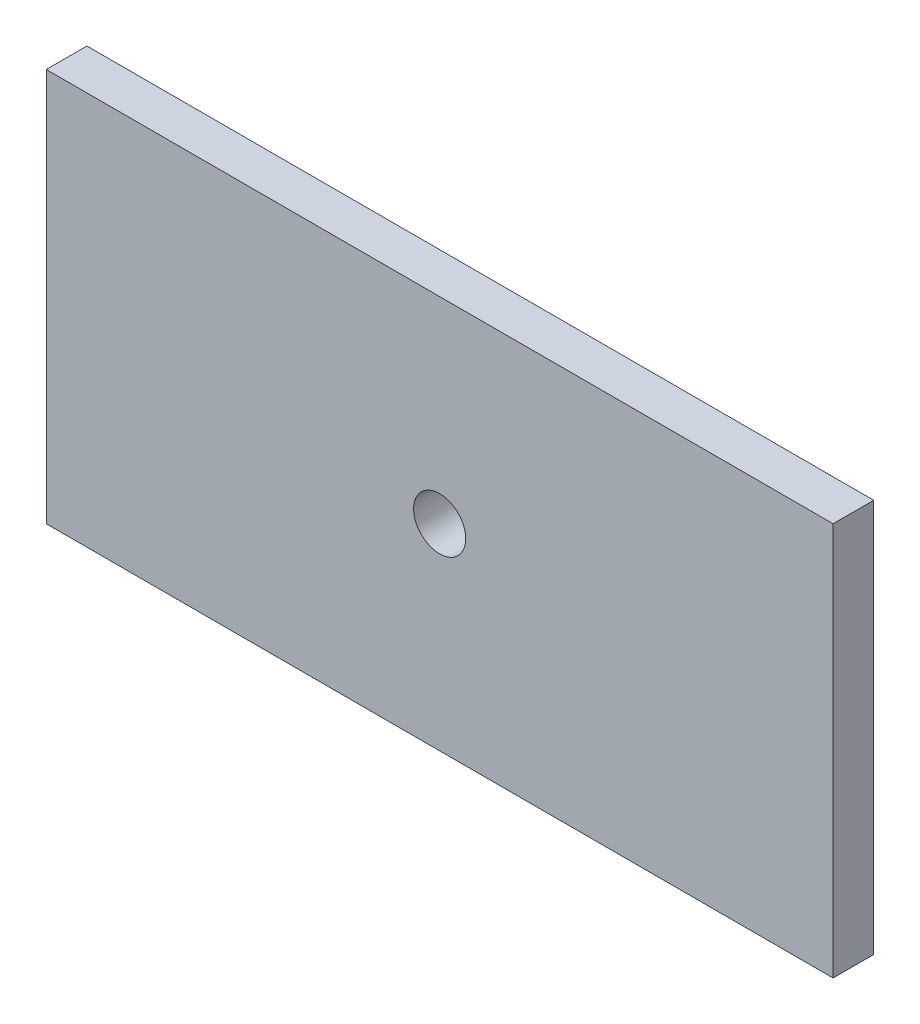
ISO-10303-21;
HEADER;
FILE_DESCRIPTION(('STEP AP214'),'2;1');
FILE_NAME('part.step','',(''),(''),'','','');
FILE_SCHEMA(('AUTOMOTIVE_DESIGN { 1 0 10303 214 1 1 1 1 }'));
ENDSEC;
DATA;
#1=APPLICATION_CONTEXT('core data for automotive mechanical design processes');
#2=APPLICATION_PROTOCOL_DEFINITION('international standard','automotive_design',2000,#1);
#3=PRODUCT_CONTEXT('',#1,'mechanical');
#4=PRODUCT('Part','Part','',(#3));
#5=PRODUCT_RELATED_PRODUCT_CATEGORY('part','',(#4));
#6=PRODUCT_DEFINITION_FORMATION('','',#4);
#7=PRODUCT_DEFINITION_CONTEXT('part definition',#1,'design');
#8=PRODUCT_DEFINITION('design','',#6,#7);
#9=PRODUCT_DEFINITION_SHAPE('','',#8);
#10=(LENGTH_UNIT() NAMED_UNIT(*) SI_UNIT(.MILLI.,.METRE.));
#11=(NAMED_UNIT(*) PLANE_ANGLE_UNIT() SI_UNIT($,.RADIAN.));
#12=(NAMED_UNIT(*) SI_UNIT($,.STERADIAN.) SOLID_ANGLE_UNIT());
#13=UNCERTAINTY_MEASURE_WITH_UNIT(LENGTH_MEASURE(1.E-05),#10,'distance_accuracy_value','');
#14=(GEOMETRIC_REPRESENTATION_CONTEXT(3) GLOBAL_UNCERTAINTY_ASSIGNED_CONTEXT((#13)) GLOBAL_UNIT_ASSIGNED_CONTEXT((#10,
#11,#12)) REPRESENTATION_CONTEXT('',''));
#15=CARTESIAN_POINT('',(0.,0.,0.));
#16=DIRECTION('',(0.,0.,1.));
#17=DIRECTION('',(1.,0.,0.));
#18=AXIS2_PLACEMENT_3D('',#15,#16,#17);
#19=CARTESIAN_POINT('',(76.2,-38.1,-7.874));
#20=DIRECTION('',(1.,0.,0.));
#21=DIRECTION('',(0.,0.,-1.));
#22=AXIS2_PLACEMENT_3D('',#19,#20,#21);
#23=PLANE('',#22);
#24=DIRECTION('',(0.,1.,0.));
#25=VECTOR('',#24,1.);
#26=CARTESIAN_POINT('',(76.2,-38.1,0.));
#27=LINE('',#26,#25);
#28=CARTESIAN_POINT('',(76.2,-38.1,0.));
#29=VERTEX_POINT('',#28);
#30=CARTESIAN_POINT('',(76.2,38.1,0.));
#31=VERTEX_POINT('',#30);
#32=EDGE_CURVE('E116',#29,#31,#27,.T.);
#33=ORIENTED_EDGE('',*,*,#32,.F.);
#34=DIRECTION('',(0.,0.,1.));
#35=VECTOR('',#34,1.);
#36=CARTESIAN_POINT('',(76.2,-38.1,-7.874));
#37=LINE('',#36,#35);
#38=CARTESIAN_POINT('',(76.2,-38.1,-7.874));
#39=VERTEX_POINT('',#38);
#40=EDGE_CURVE('E11',#39,#29,#37,.T.);
#41=ORIENTED_EDGE('',*,*,#40,.F.);
#42=DIRECTION('',(0.,1.,0.));
#43=VECTOR('',#42,1.);
#44=CARTESIAN_POINT('',(76.2,-38.1,-7.874));
#45=LINE('',#44,#43);
#46=CARTESIAN_POINT('',(76.2,38.1,-7.874));
#47=VERTEX_POINT('',#46);
#48=EDGE_CURVE('E107',#39,#47,#45,.T.);
#49=ORIENTED_EDGE('',*,*,#48,.T.);
#50=DIRECTION('',(0.,0.,1.));
#51=VECTOR('',#50,1.);
#52=CARTESIAN_POINT('',(76.2,38.1,-7.874));
#53=LINE('',#52,#51);
#54=EDGE_CURVE('E48',#47,#31,#53,.T.);
#55=ORIENTED_EDGE('',*,*,#54,.T.);
#56=EDGE_LOOP('',(#33,#41,#49,#55));
#57=FACE_BOUND('',#56,.T.);
#58=ADVANCED_FACE('F45',(#57),#23,.T.);
#59=CARTESIAN_POINT('',(-76.2,-38.1,-7.874));
#60=DIRECTION('',(0.,-1.,0.));
#61=DIRECTION('',(0.,0.,-1.));
#62=AXIS2_PLACEMENT_3D('',#59,#60,#61);
#63=PLANE('',#62);
#64=DIRECTION('',(1.,0.,0.));
#65=VECTOR('',#64,1.);
#66=CARTESIAN_POINT('',(-76.2,-38.1,0.));
#67=LINE('',#66,#65);
#68=CARTESIAN_POINT('',(-76.2,-38.1,0.));
#69=VERTEX_POINT('',#68);
#70=EDGE_CURVE('E110',#69,#29,#67,.T.);
#71=ORIENTED_EDGE('',*,*,#70,.F.);
#72=DIRECTION('',(0.,0.,1.));
#73=VECTOR('',#72,1.);
#74=CARTESIAN_POINT('',(-76.2,-38.1,-7.874));
#75=LINE('',#74,#73);
#76=CARTESIAN_POINT('',(-76.2,-38.1,-7.874));
#77=VERTEX_POINT('',#76);
#78=EDGE_CURVE('E55',#77,#69,#75,.T.);
#79=ORIENTED_EDGE('',*,*,#78,.F.);
#80=DIRECTION('',(1.,0.,0.));
#81=VECTOR('',#80,1.);
#82=CARTESIAN_POINT('',(-76.2,-38.1,-7.874));
#83=LINE('',#82,#81);
#84=EDGE_CURVE('E102',#77,#39,#83,.T.);
#85=ORIENTED_EDGE('',*,*,#84,.T.);
#86=ORIENTED_EDGE('',*,*,#40,.T.);
#87=EDGE_LOOP('',(#71,#79,#85,#86));
#88=FACE_BOUND('',#87,.T.);
#89=ADVANCED_FACE('F133',(#88),#63,.T.);
#90=CARTESIAN_POINT('',(-76.2,-38.1,-7.874));
#91=DIRECTION('',(-1.,0.,0.));
#92=DIRECTION('',(0.,0.,1.));
#93=AXIS2_PLACEMENT_3D('',#90,#91,#92);
#94=PLANE('',#93);
#95=DIRECTION('',(0.,-1.,0.));
#96=VECTOR('',#95,1.);
#97=CARTESIAN_POINT('',(-76.2,-38.1,0.));
#98=LINE('',#97,#96);
#99=CARTESIAN_POINT('',(-76.2,38.1,0.));
#100=VERTEX_POINT('',#99);
#101=EDGE_CURVE('E96',#100,#69,#98,.T.);
#102=ORIENTED_EDGE('',*,*,#101,.F.);
#103=DIRECTION('',(0.,0.,1.));
#104=VECTOR('',#103,1.);
#105=CARTESIAN_POINT('',(-76.2,38.1,-7.874));
#106=LINE('',#105,#104);
#107=CARTESIAN_POINT('',(-76.2,38.1,-7.874));
#108=VERTEX_POINT('',#107);
#109=EDGE_CURVE('E91',#108,#100,#106,.T.);
#110=ORIENTED_EDGE('',*,*,#109,.F.);
#111=DIRECTION('',(0.,-1.,0.));
#112=VECTOR('',#111,1.);
#113=CARTESIAN_POINT('',(-76.2,-38.1,-7.874));
#114=LINE('',#113,#112);
#115=EDGE_CURVE('E94',#108,#77,#114,.T.);
#116=ORIENTED_EDGE('',*,*,#115,.T.);
#117=ORIENTED_EDGE('',*,*,#78,.T.);
#118=EDGE_LOOP('',(#102,#110,#116,#117));
#119=FACE_BOUND('',#118,.T.);
#120=ADVANCED_FACE('F93',(#119),#94,.T.);
#121=CARTESIAN_POINT('',(-76.2,38.1,-7.874));
#122=DIRECTION('',(0.,1.,0.));
#123=DIRECTION('',(0.,0.,1.));
#124=AXIS2_PLACEMENT_3D('',#121,#122,#123);
#125=PLANE('',#124);
#126=DIRECTION('',(-1.,0.,0.));
#127=VECTOR('',#126,1.);
#128=CARTESIAN_POINT('',(-76.2,38.1,0.));
#129=LINE('',#128,#127);
#130=EDGE_CURVE('E120',#31,#100,#129,.T.);
#131=ORIENTED_EDGE('',*,*,#130,.F.);
#132=ORIENTED_EDGE('',*,*,#54,.F.);
#133=DIRECTION('',(-1.,0.,0.));
#134=VECTOR('',#133,1.);
#135=CARTESIAN_POINT('',(-76.2,38.1,-7.874));
#136=LINE('',#135,#134);
#137=EDGE_CURVE('E101',#47,#108,#136,.T.);
#138=ORIENTED_EDGE('',*,*,#137,.T.);
#139=ORIENTED_EDGE('',*,*,#109,.T.);
#140=EDGE_LOOP('',(#131,#132,#138,#139));
#141=FACE_BOUND('',#140,.T.);
#142=ADVANCED_FACE('F105',(#141),#125,.T.);
#143=CARTESIAN_POINT('',(0.,0.,-7.874));
#144=DIRECTION('',(0.,0.,-1.));
#145=DIRECTION('',(-1.,0.,0.));
#146=AXIS2_PLACEMENT_3D('',#143,#144,#145);
#147=PLANE('',#146);
#148=CARTESIAN_POINT('',(0.,0.,-7.874));
#149=DIRECTION('',(0.,0.,1.));
#150=DIRECTION('',(1.,0.,0.));
#151=AXIS2_PLACEMENT_3D('',#148,#149,#150);
#152=CIRCLE('',#151,5.05000006);
#153=CARTESIAN_POINT('',(5.05000006,0.,-7.874));
#154=VERTEX_POINT('',#153);
#155=EDGE_CURVE('E121',#154,#154,#152,.T.);
#156=ORIENTED_EDGE('',*,*,#155,.T.);
#157=EDGE_LOOP('',(#156));
#158=FACE_BOUND('',#157,.T.);
#159=ORIENTED_EDGE('',*,*,#48,.F.);
#160=ORIENTED_EDGE('',*,*,#84,.F.);
#161=ORIENTED_EDGE('',*,*,#115,.F.);
#162=ORIENTED_EDGE('',*,*,#137,.F.);
#163=EDGE_LOOP('',(#159,#160,#161,#162));
#164=FACE_BOUND('',#163,.T.);
#165=ADVANCED_FACE('F100',(#158,#164),#147,.T.);
#166=CARTESIAN_POINT('',(0.,0.,0.));
#167=DIRECTION('',(0.,0.,-1.));
#168=DIRECTION('',(-1.,0.,0.));
#169=AXIS2_PLACEMENT_3D('',#166,#167,#168);
#170=PLANE('',#169);
#171=CARTESIAN_POINT('',(0.,0.,0.));
#172=DIRECTION('',(0.,0.,1.));
#173=DIRECTION('',(1.,0.,0.));
#174=AXIS2_PLACEMENT_3D('',#171,#172,#173);
#175=CIRCLE('',#174,5.05000006);
#176=CARTESIAN_POINT('',(5.05000006,0.,0.));
#177=VERTEX_POINT('',#176);
#178=EDGE_CURVE('E163',#177,#177,#175,.T.);
#179=ORIENTED_EDGE('',*,*,#178,.F.);
#180=EDGE_LOOP('',(#179));
#181=FACE_BOUND('',#180,.T.);
#182=ORIENTED_EDGE('',*,*,#32,.T.);
#183=ORIENTED_EDGE('',*,*,#130,.T.);
#184=ORIENTED_EDGE('',*,*,#101,.T.);
#185=ORIENTED_EDGE('',*,*,#70,.T.);
#186=EDGE_LOOP('',(#182,#183,#184,#185));
#187=FACE_BOUND('',#186,.T.);
#188=ADVANCED_FACE('F132',(#181,#187),#170,.F.);
#189=CARTESIAN_POINT('',(0.,0.,-7.874));
#190=DIRECTION('',(0.,0.,1.));
#191=DIRECTION('',(1.,0.,0.));
#192=AXIS2_PLACEMENT_3D('',#189,#190,#191);
#193=CYLINDRICAL_SURFACE('',#192,5.05000006);
#194=ORIENTED_EDGE('',*,*,#155,.F.);
#195=EDGE_LOOP('',(#194));
#196=FACE_BOUND('',#195,.T.);
#197=ORIENTED_EDGE('',*,*,#178,.T.);
#198=EDGE_LOOP('',(#197));
#199=FACE_BOUND('',#198,.T.);
#200=ADVANCED_FACE('F151',(#196,#199),#193,.F.);
#201=CLOSED_SHELL('',(#58,#89,#120,#142,#165,#188,#200));
#202=MANIFOLD_SOLID_BREP('B2',#201);
#203=ADVANCED_BREP_SHAPE_REPRESENTATION('',(#18,#202),#14);
#204=SHAPE_DEFINITION_REPRESENTATION(#9,#203);
ENDSEC;
END-ISO-10303-21;
